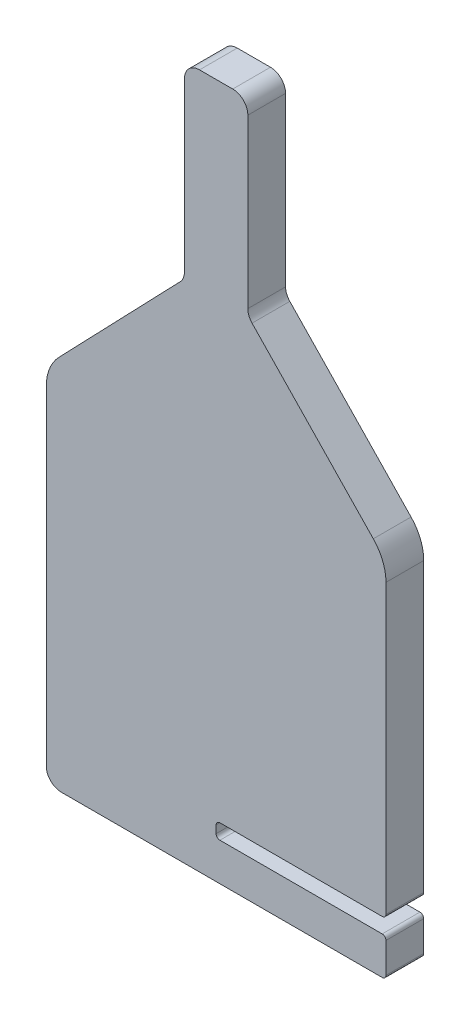
ISO-10303-21;
HEADER;
FILE_DESCRIPTION(('STEP AP214'),'2;1');
FILE_NAME('part.step','',(''),(''),'','','');
FILE_SCHEMA(('AUTOMOTIVE_DESIGN { 1 0 10303 214 1 1 1 1 }'));
ENDSEC;
DATA;
#1=APPLICATION_CONTEXT('core data for automotive mechanical design processes');
#2=APPLICATION_PROTOCOL_DEFINITION('international standard','automotive_design',2000,#1);
#3=PRODUCT_CONTEXT('',#1,'mechanical');
#4=PRODUCT('Part','Part','',(#3));
#5=PRODUCT_RELATED_PRODUCT_CATEGORY('part','',(#4));
#6=PRODUCT_DEFINITION_FORMATION('','',#4);
#7=PRODUCT_DEFINITION_CONTEXT('part definition',#1,'design');
#8=PRODUCT_DEFINITION('design','',#6,#7);
#9=PRODUCT_DEFINITION_SHAPE('','',#8);
#10=(LENGTH_UNIT() NAMED_UNIT(*) SI_UNIT(.MILLI.,.METRE.));
#11=(NAMED_UNIT(*) PLANE_ANGLE_UNIT() SI_UNIT($,.RADIAN.));
#12=(NAMED_UNIT(*) SI_UNIT($,.STERADIAN.) SOLID_ANGLE_UNIT());
#13=UNCERTAINTY_MEASURE_WITH_UNIT(LENGTH_MEASURE(1.E-05),#10,'distance_accuracy_value','');
#14=(GEOMETRIC_REPRESENTATION_CONTEXT(3) GLOBAL_UNCERTAINTY_ASSIGNED_CONTEXT((#13)) GLOBAL_UNIT_ASSIGNED_CONTEXT((#10,
#11,#12)) REPRESENTATION_CONTEXT('',''));
#15=CARTESIAN_POINT('',(0.,0.,0.));
#16=DIRECTION('',(0.,0.,1.));
#17=DIRECTION('',(1.,0.,0.));
#18=AXIS2_PLACEMENT_3D('',#15,#16,#17);
#19=CARTESIAN_POINT('',(22.5,0.971862939320625,5.));
#20=DIRECTION('',(1.,0.,0.));
#21=DIRECTION('',(0.,1.,0.));
#22=AXIS2_PLACEMENT_3D('',#19,#20,#21);
#23=PLANE('',#22);
#24=DIRECTION('',(0.,-1.,0.));
#25=VECTOR('',#24,1.);
#26=CARTESIAN_POINT('',(22.5,0.971862939320625,5.));
#27=LINE('',#26,#25);
#28=CARTESIAN_POINT('',(22.5,-1.4452330721166,5.));
#29=VERTEX_POINT('',#28);
#30=CARTESIAN_POINT('',(22.5,-39.5281370606794,5.));
#31=VERTEX_POINT('',#30);
#32=EDGE_CURVE('E403',#29,#31,#27,.T.);
#33=ORIENTED_EDGE('',*,*,#32,.T.);
#34=DIRECTION('',(0.,0.,1.));
#35=VECTOR('',#34,1.);
#36=CARTESIAN_POINT('',(22.5,-39.5281370606794,0.));
#37=LINE('',#36,#35);
#38=CARTESIAN_POINT('',(22.5,-39.5281370606794,0.));
#39=VERTEX_POINT('',#38);
#40=EDGE_CURVE('E382',#31,#39,#37,.F.);
#41=ORIENTED_EDGE('',*,*,#40,.T.);
#42=DIRECTION('',(0.,-1.,0.));
#43=VECTOR('',#42,1.);
#44=CARTESIAN_POINT('',(22.5,0.971862939320625,0.));
#45=LINE('',#44,#43);
#46=CARTESIAN_POINT('',(22.5,-1.4452330721166,0.));
#47=VERTEX_POINT('',#46);
#48=EDGE_CURVE('E234',#47,#39,#45,.T.);
#49=ORIENTED_EDGE('',*,*,#48,.F.);
#50=DIRECTION('',(0.,0.,-1.));
#51=VECTOR('',#50,1.);
#52=CARTESIAN_POINT('',(22.5,-1.4452330721166,5.));
#53=LINE('',#52,#51);
#54=EDGE_CURVE('E331',#47,#29,#53,.F.);
#55=ORIENTED_EDGE('',*,*,#54,.T.);
#56=EDGE_LOOP('',(#33,#41,#49,#55));
#57=FACE_BOUND('',#56,.T.);
#58=ADVANCED_FACE('F43',(#57),#23,.T.);
#59=CARTESIAN_POINT('',(-4.2,45.,5.));
#60=DIRECTION('',(0.,1.,0.));
#61=DIRECTION('',(0.,0.,1.));
#62=AXIS2_PLACEMENT_3D('',#59,#60,#61);
#63=PLANE('',#62);
#64=DIRECTION('',(1.,0.,0.));
#65=VECTOR('',#64,1.);
#66=CARTESIAN_POINT('',(-4.2,45.,0.));
#67=LINE('',#66,#65);
#68=CARTESIAN_POINT('',(-2.2,45.,0.));
#69=VERTEX_POINT('',#68);
#70=CARTESIAN_POINT('',(2.2,45.,0.));
#71=VERTEX_POINT('',#70);
#72=EDGE_CURVE('E427',#69,#71,#67,.T.);
#73=ORIENTED_EDGE('',*,*,#72,.F.);
#74=DIRECTION('',(0.,0.,-1.));
#75=VECTOR('',#74,1.);
#76=CARTESIAN_POINT('',(-2.2,45.,5.));
#77=LINE('',#76,#75);
#78=CARTESIAN_POINT('',(-2.2,45.,5.));
#79=VERTEX_POINT('',#78);
#80=EDGE_CURVE('E283',#69,#79,#77,.F.);
#81=ORIENTED_EDGE('',*,*,#80,.T.);
#82=DIRECTION('',(1.,0.,0.));
#83=VECTOR('',#82,1.);
#84=CARTESIAN_POINT('',(-4.2,45.,5.));
#85=LINE('',#84,#83);
#86=CARTESIAN_POINT('',(2.2,45.,5.));
#87=VERTEX_POINT('',#86);
#88=EDGE_CURVE('E251',#79,#87,#85,.T.);
#89=ORIENTED_EDGE('',*,*,#88,.T.);
#90=DIRECTION('',(0.,0.,-1.));
#91=VECTOR('',#90,1.);
#92=CARTESIAN_POINT('',(2.2,45.,5.));
#93=LINE('',#92,#91);
#94=EDGE_CURVE('E279',#87,#71,#93,.T.);
#95=ORIENTED_EDGE('',*,*,#94,.T.);
#96=EDGE_LOOP('',(#73,#81,#89,#95));
#97=FACE_BOUND('',#96,.T.);
#98=ADVANCED_FACE('F518',(#97),#63,.T.);
#99=CARTESIAN_POINT('',(-4.2,45.,5.));
#100=DIRECTION('',(1.,0.,0.));
#101=DIRECTION('',(0.,1.,0.));
#102=AXIS2_PLACEMENT_3D('',#99,#100,#101);
#103=PLANE('',#102);
#104=DIRECTION('',(0.,-1.,0.));
#105=VECTOR('',#104,1.);
#106=CARTESIAN_POINT('',(-4.2,45.,0.));
#107=LINE('',#106,#105);
#108=CARTESIAN_POINT('',(-4.2,43.,0.));
#109=VERTEX_POINT('',#108);
#110=CARTESIAN_POINT('',(-4.19999999999999,20.8056680808001,0.));
#111=VERTEX_POINT('',#110);
#112=EDGE_CURVE('E248',#109,#111,#107,.T.);
#113=ORIENTED_EDGE('',*,*,#112,.T.);
#114=DIRECTION('',(0.,0.,-1.));
#115=VECTOR('',#114,1.);
#116=CARTESIAN_POINT('',(-4.19999999999999,20.8056680808001,5.));
#117=LINE('',#116,#115);
#118=CARTESIAN_POINT('',(-4.19999999999999,20.8056680808001,5.));
#119=VERTEX_POINT('',#118);
#120=EDGE_CURVE('E276',#111,#119,#117,.F.);
#121=ORIENTED_EDGE('',*,*,#120,.T.);
#122=DIRECTION('',(0.,-1.,0.));
#123=VECTOR('',#122,1.);
#124=CARTESIAN_POINT('',(-4.2,45.,5.));
#125=LINE('',#124,#123);
#126=CARTESIAN_POINT('',(-4.2,43.,5.));
#127=VERTEX_POINT('',#126);
#128=EDGE_CURVE('E227',#127,#119,#125,.T.);
#129=ORIENTED_EDGE('',*,*,#128,.F.);
#130=DIRECTION('',(0.,0.,-1.));
#131=VECTOR('',#130,1.);
#132=CARTESIAN_POINT('',(-4.2,43.,0.));
#133=LINE('',#132,#131);
#134=EDGE_CURVE('E272',#127,#109,#133,.T.);
#135=ORIENTED_EDGE('',*,*,#134,.T.);
#136=EDGE_LOOP('',(#113,#121,#129,#135));
#137=FACE_BOUND('',#136,.T.);
#138=ADVANCED_FACE('F527',(#137),#103,.F.);
#139=CARTESIAN_POINT('',(-4.19999999999999,20.,5.));
#140=DIRECTION('',(0.720762767449976,-0.693181818181819,0.));
#141=DIRECTION('',(0.693181818181819,0.720762767449976,0.));
#142=AXIS2_PLACEMENT_3D('',#139,#140,#141);
#143=PLANE('',#142);
#144=DIRECTION('',(-0.693181818181819,-0.720762767449976,0.));
#145=VECTOR('',#144,1.);
#146=CARTESIAN_POINT('',(-4.19999999999999,20.,0.));
#147=LINE('',#146,#145);
#148=CARTESIAN_POINT('',(-4.75847446510004,19.4193044444364,0.));
#149=VERTEX_POINT('',#148);
#150=CARTESIAN_POINT('',(-20.8245766046999,2.71394960601132,0.));
#151=VERTEX_POINT('',#150);
#152=EDGE_CURVE('E238',#149,#151,#147,.T.);
#153=ORIENTED_EDGE('',*,*,#152,.T.);
#154=DIRECTION('',(0.,0.,-1.));
#155=VECTOR('',#154,1.);
#156=CARTESIAN_POINT('',(-20.8245766046999,2.71394960601132,5.));
#157=LINE('',#156,#155);
#158=CARTESIAN_POINT('',(-20.8245766046999,2.71394960601132,5.));
#159=VERTEX_POINT('',#158);
#160=EDGE_CURVE('E318',#151,#159,#157,.F.);
#161=ORIENTED_EDGE('',*,*,#160,.T.);
#162=DIRECTION('',(-0.693181818181819,-0.720762767449976,0.));
#163=VECTOR('',#162,1.);
#164=CARTESIAN_POINT('',(-4.19999999999999,20.,5.));
#165=LINE('',#164,#163);
#166=CARTESIAN_POINT('',(-4.75847446510004,19.4193044444364,5.));
#167=VERTEX_POINT('',#166);
#168=EDGE_CURVE('E394',#167,#159,#165,.T.);
#169=ORIENTED_EDGE('',*,*,#168,.F.);
#170=DIRECTION('',(0.,0.,-1.));
#171=VECTOR('',#170,1.);
#172=CARTESIAN_POINT('',(-4.75847446510004,19.4193044444364,0.));
#173=LINE('',#172,#171);
#174=EDGE_CURVE('E268',#167,#149,#173,.T.);
#175=ORIENTED_EDGE('',*,*,#174,.T.);
#176=EDGE_LOOP('',(#153,#161,#169,#175));
#177=FACE_BOUND('',#176,.T.);
#178=ADVANCED_FACE('F536',(#177),#143,.F.);
#179=CARTESIAN_POINT('',(-22.5,0.971862939320623,5.));
#180=DIRECTION('',(1.,0.,0.));
#181=DIRECTION('',(0.,1.,0.));
#182=AXIS2_PLACEMENT_3D('',#179,#180,#181);
#183=PLANE('',#182);
#184=DIRECTION('',(0.,-1.,0.));
#185=VECTOR('',#184,1.);
#186=CARTESIAN_POINT('',(-22.5,0.971862939320623,5.));
#187=LINE('',#186,#185);
#188=CARTESIAN_POINT('',(-22.5,-1.44514130307958,5.));
#189=VERTEX_POINT('',#188);
#190=CARTESIAN_POINT('',(-22.5,-45.0281370606794,5.));
#191=VERTEX_POINT('',#190);
#192=EDGE_CURVE('E398',#189,#191,#187,.T.);
#193=ORIENTED_EDGE('',*,*,#192,.F.);
#194=DIRECTION('',(0.,0.,-1.));
#195=VECTOR('',#194,1.);
#196=CARTESIAN_POINT('',(-22.5,-1.44514130307958,5.));
#197=LINE('',#196,#195);
#198=CARTESIAN_POINT('',(-22.5,-1.44514130307958,0.));
#199=VERTEX_POINT('',#198);
#200=EDGE_CURVE('E308',#189,#199,#197,.T.);
#201=ORIENTED_EDGE('',*,*,#200,.T.);
#202=DIRECTION('',(0.,-1.,0.));
#203=VECTOR('',#202,1.);
#204=CARTESIAN_POINT('',(-22.5,0.971862939320623,0.));
#205=LINE('',#204,#203);
#206=CARTESIAN_POINT('',(-22.5,-45.0281370606794,0.));
#207=VERTEX_POINT('',#206);
#208=EDGE_CURVE('E233',#199,#207,#205,.T.);
#209=ORIENTED_EDGE('',*,*,#208,.T.);
#210=DIRECTION('',(0.,0.,-1.));
#211=VECTOR('',#210,1.);
#212=CARTESIAN_POINT('',(-22.5,-45.0281370606794,5.));
#213=LINE('',#212,#211);
#214=EDGE_CURVE('E210',#207,#191,#213,.F.);
#215=ORIENTED_EDGE('',*,*,#214,.T.);
#216=EDGE_LOOP('',(#193,#201,#209,#215));
#217=FACE_BOUND('',#216,.T.);
#218=ADVANCED_FACE('F544',(#217),#183,.F.);
#219=CARTESIAN_POINT('',(-22.5,-47.0281370606794,5.));
#220=DIRECTION('',(0.,1.,0.));
#221=DIRECTION('',(0.,0.,1.));
#222=AXIS2_PLACEMENT_3D('',#219,#220,#221);
#223=PLANE('',#222);
#224=DIRECTION('',(1.,0.,0.));
#225=VECTOR('',#224,1.);
#226=CARTESIAN_POINT('',(-22.5,-47.0281370606794,0.));
#227=LINE('',#226,#225);
#228=CARTESIAN_POINT('',(-20.5,-47.0281370606794,0.));
#229=VERTEX_POINT('',#228);
#230=CARTESIAN_POINT('',(22.,-47.0281370606794,0.));
#231=VERTEX_POINT('',#230);
#232=EDGE_CURVE('E221',#229,#231,#227,.T.);
#233=ORIENTED_EDGE('',*,*,#232,.T.);
#234=DIRECTION('',(0.,0.,-1.));
#235=VECTOR('',#234,1.);
#236=CARTESIAN_POINT('',(22.,-47.0281370606794,5.));
#237=LINE('',#236,#235);
#238=CARTESIAN_POINT('',(22.,-47.0281370606794,5.));
#239=VERTEX_POINT('',#238);
#240=EDGE_CURVE('E350',#231,#239,#237,.F.);
#241=ORIENTED_EDGE('',*,*,#240,.T.);
#242=DIRECTION('',(1.,0.,0.));
#243=VECTOR('',#242,1.);
#244=CARTESIAN_POINT('',(-22.5,-47.0281370606794,5.));
#245=LINE('',#244,#243);
#246=CARTESIAN_POINT('',(-20.5,-47.0281370606794,5.));
#247=VERTEX_POINT('',#246);
#248=EDGE_CURVE('E224',#247,#239,#245,.T.);
#249=ORIENTED_EDGE('',*,*,#248,.F.);
#250=DIRECTION('',(0.,0.,-1.));
#251=VECTOR('',#250,1.);
#252=CARTESIAN_POINT('',(-20.5,-47.0281370606794,5.));
#253=LINE('',#252,#251);
#254=EDGE_CURVE('E208',#247,#229,#253,.T.);
#255=ORIENTED_EDGE('',*,*,#254,.T.);
#256=EDGE_LOOP('',(#233,#241,#249,#255));
#257=FACE_BOUND('',#256,.T.);
#258=ADVANCED_FACE('F220',(#257),#223,.F.);
#259=CARTESIAN_POINT('',(22.5,-42.5281370606794,5.));
#260=VERTEX_POINT('',#259);
#261=CARTESIAN_POINT('',(22.5,-46.5281370606794,5.));
#262=VERTEX_POINT('',#261);
#263=EDGE_CURVE('E406',#260,#262,#27,.T.);
#264=ORIENTED_EDGE('',*,*,#263,.T.);
#265=DIRECTION('',(0.,0.,-1.));
#266=VECTOR('',#265,1.);
#267=CARTESIAN_POINT('',(22.5,-46.5281370606794,0.));
#268=LINE('',#267,#266);
#269=CARTESIAN_POINT('',(22.5,-46.5281370606794,0.));
#270=VERTEX_POINT('',#269);
#271=EDGE_CURVE('E338',#262,#270,#268,.T.);
#272=ORIENTED_EDGE('',*,*,#271,.T.);
#273=CARTESIAN_POINT('',(22.5,-42.5281370606794,0.));
#274=VERTEX_POINT('',#273);
#275=EDGE_CURVE('E241',#274,#270,#45,.T.);
#276=ORIENTED_EDGE('',*,*,#275,.F.);
#277=DIRECTION('',(0.,0.,1.));
#278=VECTOR('',#277,1.);
#279=CARTESIAN_POINT('',(22.5,-42.5281370606794,5.));
#280=LINE('',#279,#278);
#281=EDGE_CURVE('E334',#274,#260,#280,.T.);
#282=ORIENTED_EDGE('',*,*,#281,.T.);
#283=EDGE_LOOP('',(#264,#272,#276,#282));
#284=FACE_BOUND('',#283,.T.);
#285=ADVANCED_FACE('F445',(#284),#23,.T.);
#286=CARTESIAN_POINT('',(4.20000000000001,19.9989976751405,5.));
#287=DIRECTION('',(0.720744523590116,0.693200787445352,0.));
#288=DIRECTION('',(-0.693200787445352,0.720744523590116,0.));
#289=AXIS2_PLACEMENT_3D('',#286,#287,#288);
#290=PLANE('',#289);
#291=DIRECTION('',(0.693200787445352,-0.720744523590116,0.));
#292=VECTOR('',#291,1.);
#293=CARTESIAN_POINT('',(4.20000000000001,19.9989976751405,5.));
#294=LINE('',#293,#292);
#295=CARTESIAN_POINT('',(4.75851095281978,19.4182947707288,5.));
#296=VERTEX_POINT('',#295);
#297=CARTESIAN_POINT('',(20.8244671415407,2.71397165255552,5.));
#298=VERTEX_POINT('',#297);
#299=EDGE_CURVE('E410',#296,#298,#294,.T.);
#300=ORIENTED_EDGE('',*,*,#299,.T.);
#301=DIRECTION('',(0.,0.,-1.));
#302=VECTOR('',#301,1.);
#303=CARTESIAN_POINT('',(20.8244671415407,2.71397165255551,5.));
#304=LINE('',#303,#302);
#305=CARTESIAN_POINT('',(20.8244671415407,2.71397165255552,0.));
#306=VERTEX_POINT('',#305);
#307=EDGE_CURVE('E327',#298,#306,#304,.T.);
#308=ORIENTED_EDGE('',*,*,#307,.T.);
#309=DIRECTION('',(0.693200787445352,-0.720744523590116,0.));
#310=VECTOR('',#309,1.);
#311=CARTESIAN_POINT('',(4.20000000000001,19.9989976751405,0.));
#312=LINE('',#311,#310);
#313=CARTESIAN_POINT('',(4.75851095281978,19.4182947707288,0.));
#314=VERTEX_POINT('',#313);
#315=EDGE_CURVE('E435',#314,#306,#312,.T.);
#316=ORIENTED_EDGE('',*,*,#315,.F.);
#317=DIRECTION('',(0.,0.,-1.));
#318=VECTOR('',#317,1.);
#319=CARTESIAN_POINT('',(4.75851095281978,19.4182947707288,5.));
#320=LINE('',#319,#318);
#321=EDGE_CURVE('E293',#314,#296,#320,.F.);
#322=ORIENTED_EDGE('',*,*,#321,.T.);
#323=EDGE_LOOP('',(#300,#308,#316,#322));
#324=FACE_BOUND('',#323,.T.);
#325=ADVANCED_FACE('F503',(#324),#290,.T.);
#326=CARTESIAN_POINT('',(4.2,45.,5.));
#327=DIRECTION('',(1.,0.,0.));
#328=DIRECTION('',(0.,1.,0.));
#329=AXIS2_PLACEMENT_3D('',#326,#327,#328);
#330=PLANE('',#329);
#331=DIRECTION('',(0.,-1.,0.));
#332=VECTOR('',#331,1.);
#333=CARTESIAN_POINT('',(4.2,45.,5.));
#334=LINE('',#333,#332);
#335=CARTESIAN_POINT('',(4.2,43.,5.));
#336=VERTEX_POINT('',#335);
#337=CARTESIAN_POINT('',(4.20000000000001,20.8046963456195,5.));
#338=VERTEX_POINT('',#337);
#339=EDGE_CURVE('E413',#336,#338,#334,.T.);
#340=ORIENTED_EDGE('',*,*,#339,.T.);
#341=DIRECTION('',(0.,0.,-1.));
#342=VECTOR('',#341,1.);
#343=CARTESIAN_POINT('',(4.20000000000001,20.8046963456195,0.));
#344=LINE('',#343,#342);
#345=CARTESIAN_POINT('',(4.20000000000001,20.8046963456195,0.));
#346=VERTEX_POINT('',#345);
#347=EDGE_CURVE('E289',#338,#346,#344,.T.);
#348=ORIENTED_EDGE('',*,*,#347,.T.);
#349=DIRECTION('',(0.,-1.,0.));
#350=VECTOR('',#349,1.);
#351=CARTESIAN_POINT('',(4.2,45.,0.));
#352=LINE('',#351,#350);
#353=CARTESIAN_POINT('',(4.2,43.,0.));
#354=VERTEX_POINT('',#353);
#355=EDGE_CURVE('E431',#354,#346,#352,.T.);
#356=ORIENTED_EDGE('',*,*,#355,.F.);
#357=DIRECTION('',(0.,0.,-1.));
#358=VECTOR('',#357,1.);
#359=CARTESIAN_POINT('',(4.2,43.,5.));
#360=LINE('',#359,#358);
#361=EDGE_CURVE('E286',#354,#336,#360,.F.);
#362=ORIENTED_EDGE('',*,*,#361,.T.);
#363=EDGE_LOOP('',(#340,#348,#356,#362));
#364=FACE_BOUND('',#363,.T.);
#365=ADVANCED_FACE('F512',(#364),#330,.T.);
#366=CARTESIAN_POINT('',(0.,0.,5.));
#367=DIRECTION('',(0.,0.,-1.));
#368=DIRECTION('',(-1.,0.,0.));
#369=AXIS2_PLACEMENT_3D('',#366,#367,#368);
#370=PLANE('',#369);
#371=ORIENTED_EDGE('',*,*,#248,.T.);
#372=CARTESIAN_POINT('',(22.,-46.5281370606794,5.));
#373=DIRECTION('',(0.,0.,-1.));
#374=DIRECTION('',(-1.,0.,0.));
#375=AXIS2_PLACEMENT_3D('',#372,#373,#374);
#376=CIRCLE('',#375,0.5);
#377=EDGE_CURVE('E358',#239,#262,#376,.F.);
#378=ORIENTED_EDGE('',*,*,#377,.T.);
#379=ORIENTED_EDGE('',*,*,#263,.F.);
#380=CARTESIAN_POINT('',(22.,-42.5281370606794,5.));
#381=DIRECTION('',(0.,0.,-1.));
#382=DIRECTION('',(-1.,0.,0.));
#383=AXIS2_PLACEMENT_3D('',#380,#381,#382);
#384=CIRCLE('',#383,0.5);
#385=CARTESIAN_POINT('',(22.,-42.0281370606794,5.));
#386=VERTEX_POINT('',#385);
#387=EDGE_CURVE('E353',#260,#386,#384,.F.);
#388=ORIENTED_EDGE('',*,*,#387,.T.);
#389=DIRECTION('',(1.,0.,0.));
#390=VECTOR('',#389,1.);
#391=CARTESIAN_POINT('',(22.5,-42.0281370606794,5.));
#392=LINE('',#391,#390);
#393=CARTESIAN_POINT('',(0.500000000000004,-42.0281370606794,5.));
#394=VERTEX_POINT('',#393);
#395=EDGE_CURVE('E453',#394,#386,#392,.T.);
#396=ORIENTED_EDGE('',*,*,#395,.F.);
#397=CARTESIAN_POINT('',(0.499999999999997,-41.5281370606794,5.));
#398=DIRECTION('',(0.,0.,-1.));
#399=DIRECTION('',(-1.,0.,0.));
#400=AXIS2_PLACEMENT_3D('',#397,#398,#399);
#401=CIRCLE('',#400,0.5);
#402=CARTESIAN_POINT('',(0.,-41.5281370606794,5.));
#403=VERTEX_POINT('',#402);
#404=EDGE_CURVE('E385',#394,#403,#401,.T.);
#405=ORIENTED_EDGE('',*,*,#404,.T.);
#406=DIRECTION('',(0.,-1.,0.));
#407=VECTOR('',#406,1.);
#408=CARTESIAN_POINT('',(0.,-40.0281370606794,5.));
#409=LINE('',#408,#407);
#410=CARTESIAN_POINT('',(0.,-40.5281370606794,5.));
#411=VERTEX_POINT('',#410);
#412=EDGE_CURVE('E460',#411,#403,#409,.T.);
#413=ORIENTED_EDGE('',*,*,#412,.F.);
#414=CARTESIAN_POINT('',(0.499999999999996,-40.5281370606794,5.));
#415=DIRECTION('',(0.,0.,-1.));
#416=DIRECTION('',(-1.,0.,0.));
#417=AXIS2_PLACEMENT_3D('',#414,#415,#416);
#418=CIRCLE('',#417,0.5);
#419=CARTESIAN_POINT('',(0.500000000000004,-40.0281370606794,5.));
#420=VERTEX_POINT('',#419);
#421=EDGE_CURVE('E52',#411,#420,#418,.T.);
#422=ORIENTED_EDGE('',*,*,#421,.T.);
#423=DIRECTION('',(-1.,0.,0.));
#424=VECTOR('',#423,1.);
#425=CARTESIAN_POINT('',(22.5,-40.0281370606794,5.));
#426=LINE('',#425,#424);
#427=CARTESIAN_POINT('',(22.,-40.0281370606794,5.));
#428=VERTEX_POINT('',#427);
#429=EDGE_CURVE('E467',#428,#420,#426,.T.);
#430=ORIENTED_EDGE('',*,*,#429,.F.);
#431=CARTESIAN_POINT('',(22.,-39.5281370606794,5.));
#432=DIRECTION('',(0.,0.,-1.));
#433=DIRECTION('',(-1.,0.,0.));
#434=AXIS2_PLACEMENT_3D('',#431,#432,#433);
#435=CIRCLE('',#434,0.5);
#436=EDGE_CURVE('E59',#428,#31,#435,.F.);
#437=ORIENTED_EDGE('',*,*,#436,.T.);
#438=ORIENTED_EDGE('',*,*,#32,.F.);
#439=CARTESIAN_POINT('',(16.5,-1.4452330721166,5.));
#440=DIRECTION('',(0.,0.,-1.));
#441=DIRECTION('',(-1.,0.,0.));
#442=AXIS2_PLACEMENT_3D('',#439,#440,#441);
#443=CIRCLE('',#442,6.);
#444=EDGE_CURVE('E321',#29,#298,#443,.F.);
#445=ORIENTED_EDGE('',*,*,#444,.T.);
#446=ORIENTED_EDGE('',*,*,#299,.F.);
#447=CARTESIAN_POINT('',(6.20000000000001,20.8046963456195,5.));
#448=DIRECTION('',(0.,0.,-1.));
#449=DIRECTION('',(-1.,0.,0.));
#450=AXIS2_PLACEMENT_3D('',#447,#448,#449);
#451=CIRCLE('',#450,2.);
#452=EDGE_CURVE('E305',#296,#338,#451,.T.);
#453=ORIENTED_EDGE('',*,*,#452,.T.);
#454=ORIENTED_EDGE('',*,*,#339,.F.);
#455=CARTESIAN_POINT('',(2.2,43.,5.));
#456=DIRECTION('',(0.,0.,-1.));
#457=DIRECTION('',(-1.,0.,0.));
#458=AXIS2_PLACEMENT_3D('',#455,#456,#457);
#459=CIRCLE('',#458,2.);
#460=EDGE_CURVE('E259',#336,#87,#459,.F.);
#461=ORIENTED_EDGE('',*,*,#460,.T.);
#462=ORIENTED_EDGE('',*,*,#88,.F.);
#463=CARTESIAN_POINT('',(-2.2,43.,5.));
#464=DIRECTION('',(0.,0.,-1.));
#465=DIRECTION('',(-1.,0.,0.));
#466=AXIS2_PLACEMENT_3D('',#463,#464,#465);
#467=CIRCLE('',#466,2.);
#468=EDGE_CURVE('E262',#79,#127,#467,.F.);
#469=ORIENTED_EDGE('',*,*,#468,.T.);
#470=ORIENTED_EDGE('',*,*,#128,.T.);
#471=CARTESIAN_POINT('',(-6.19999999999999,20.8056680808001,5.));
#472=DIRECTION('',(0.,0.,-1.));
#473=DIRECTION('',(-1.,0.,0.));
#474=AXIS2_PLACEMENT_3D('',#471,#472,#473);
#475=CIRCLE('',#474,2.);
#476=EDGE_CURVE('E299',#119,#167,#475,.T.);
#477=ORIENTED_EDGE('',*,*,#476,.T.);
#478=ORIENTED_EDGE('',*,*,#168,.T.);
#479=CARTESIAN_POINT('',(-16.5,-1.44514130307958,5.));
#480=DIRECTION('',(0.,0.,-1.));
#481=DIRECTION('',(-1.,0.,0.));
#482=AXIS2_PLACEMENT_3D('',#479,#480,#481);
#483=CIRCLE('',#482,6.);
#484=EDGE_CURVE('E324',#159,#189,#483,.F.);
#485=ORIENTED_EDGE('',*,*,#484,.T.);
#486=ORIENTED_EDGE('',*,*,#192,.T.);
#487=CARTESIAN_POINT('',(-20.5,-45.0281370606794,5.));
#488=DIRECTION('',(0.,0.,-1.));
#489=DIRECTION('',(-1.,0.,0.));
#490=AXIS2_PLACEMENT_3D('',#487,#488,#489);
#491=CIRCLE('',#490,2.);
#492=EDGE_CURVE('E265',#191,#247,#491,.F.);
#493=ORIENTED_EDGE('',*,*,#492,.T.);
#494=EDGE_LOOP('',(#371,#378,#379,#388,#396,#405,#413,#422,#430,#437,#438,#445,#446,#453,#454,
#461,#462,#469,#470,#477,#478,#485,#486,#493));
#495=FACE_BOUND('',#494,.T.);
#496=ADVANCED_FACE('F452',(#495),#370,.F.);
#497=CARTESIAN_POINT('',(0.,0.,0.));
#498=DIRECTION('',(0.,0.,-1.));
#499=DIRECTION('',(-1.,0.,0.));
#500=AXIS2_PLACEMENT_3D('',#497,#498,#499);
#501=PLANE('',#500);
#502=ORIENTED_EDGE('',*,*,#275,.T.);
#503=CARTESIAN_POINT('',(22.,-46.5281370606794,0.));
#504=DIRECTION('',(0.,0.,-1.));
#505=DIRECTION('',(-1.,0.,0.));
#506=AXIS2_PLACEMENT_3D('',#503,#504,#505);
#507=CIRCLE('',#506,0.5);
#508=EDGE_CURVE('E231',#270,#231,#507,.T.);
#509=ORIENTED_EDGE('',*,*,#508,.T.);
#510=ORIENTED_EDGE('',*,*,#232,.F.);
#511=CARTESIAN_POINT('',(-20.5,-45.0281370606794,0.));
#512=DIRECTION('',(0.,0.,-1.));
#513=DIRECTION('',(-1.,0.,0.));
#514=AXIS2_PLACEMENT_3D('',#511,#512,#513);
#515=CIRCLE('',#514,2.);
#516=EDGE_CURVE('E204',#229,#207,#515,.T.);
#517=ORIENTED_EDGE('',*,*,#516,.T.);
#518=ORIENTED_EDGE('',*,*,#208,.F.);
#519=CARTESIAN_POINT('',(-16.5,-1.44514130307958,0.));
#520=DIRECTION('',(0.,0.,-1.));
#521=DIRECTION('',(-1.,0.,0.));
#522=AXIS2_PLACEMENT_3D('',#519,#520,#521);
#523=CIRCLE('',#522,6.);
#524=EDGE_CURVE('E315',#199,#151,#523,.T.);
#525=ORIENTED_EDGE('',*,*,#524,.T.);
#526=ORIENTED_EDGE('',*,*,#152,.F.);
#527=CARTESIAN_POINT('',(-6.19999999999999,20.8056680808001,0.));
#528=DIRECTION('',(0.,0.,-1.));
#529=DIRECTION('',(-1.,0.,0.));
#530=AXIS2_PLACEMENT_3D('',#527,#528,#529);
#531=CIRCLE('',#530,2.);
#532=EDGE_CURVE('E296',#149,#111,#531,.F.);
#533=ORIENTED_EDGE('',*,*,#532,.T.);
#534=ORIENTED_EDGE('',*,*,#112,.F.);
#535=CARTESIAN_POINT('',(-2.2,43.,0.));
#536=DIRECTION('',(0.,0.,-1.));
#537=DIRECTION('',(-1.,0.,0.));
#538=AXIS2_PLACEMENT_3D('',#535,#536,#537);
#539=CIRCLE('',#538,2.);
#540=EDGE_CURVE('E215',#109,#69,#539,.T.);
#541=ORIENTED_EDGE('',*,*,#540,.T.);
#542=ORIENTED_EDGE('',*,*,#72,.T.);
#543=CARTESIAN_POINT('',(2.2,43.,0.));
#544=DIRECTION('',(0.,0.,-1.));
#545=DIRECTION('',(-1.,0.,0.));
#546=AXIS2_PLACEMENT_3D('',#543,#544,#545);
#547=CIRCLE('',#546,2.);
#548=EDGE_CURVE('E226',#71,#354,#547,.T.);
#549=ORIENTED_EDGE('',*,*,#548,.T.);
#550=ORIENTED_EDGE('',*,*,#355,.T.);
#551=CARTESIAN_POINT('',(6.20000000000001,20.8046963456195,0.));
#552=DIRECTION('',(0.,0.,-1.));
#553=DIRECTION('',(-1.,0.,0.));
#554=AXIS2_PLACEMENT_3D('',#551,#552,#553);
#555=CIRCLE('',#554,2.);
#556=EDGE_CURVE('E302',#346,#314,#555,.F.);
#557=ORIENTED_EDGE('',*,*,#556,.T.);
#558=ORIENTED_EDGE('',*,*,#315,.T.);
#559=CARTESIAN_POINT('',(16.5,-1.4452330721166,0.));
#560=DIRECTION('',(0.,0.,-1.));
#561=DIRECTION('',(-1.,0.,0.));
#562=AXIS2_PLACEMENT_3D('',#559,#560,#561);
#563=CIRCLE('',#562,6.);
#564=EDGE_CURVE('E312',#306,#47,#563,.T.);
#565=ORIENTED_EDGE('',*,*,#564,.T.);
#566=ORIENTED_EDGE('',*,*,#48,.T.);
#567=CARTESIAN_POINT('',(22.,-39.5281370606794,0.));
#568=DIRECTION('',(0.,0.,-1.));
#569=DIRECTION('',(-1.,0.,0.));
#570=AXIS2_PLACEMENT_3D('',#567,#568,#569);
#571=CIRCLE('',#570,0.5);
#572=CARTESIAN_POINT('',(22.,-40.0281370606794,0.));
#573=VERTEX_POINT('',#572);
#574=EDGE_CURVE('E345',#39,#573,#571,.T.);
#575=ORIENTED_EDGE('',*,*,#574,.T.);
#576=DIRECTION('',(-1.,0.,0.));
#577=VECTOR('',#576,1.);
#578=CARTESIAN_POINT('',(22.5,-40.0281370606794,0.));
#579=LINE('',#578,#577);
#580=CARTESIAN_POINT('',(0.499999999999997,-40.0281370606794,0.));
#581=VERTEX_POINT('',#580);
#582=EDGE_CURVE('E459',#573,#581,#579,.T.);
#583=ORIENTED_EDGE('',*,*,#582,.T.);
#584=CARTESIAN_POINT('',(0.499999999999996,-40.5281370606794,0.));
#585=DIRECTION('',(0.,0.,-1.));
#586=DIRECTION('',(-1.,0.,0.));
#587=AXIS2_PLACEMENT_3D('',#584,#585,#586);
#588=CIRCLE('',#587,0.5);
#589=CARTESIAN_POINT('',(0.,-40.5281370606794,0.));
#590=VERTEX_POINT('',#589);
#591=EDGE_CURVE('E11',#581,#590,#588,.F.);
#592=ORIENTED_EDGE('',*,*,#591,.T.);
#593=DIRECTION('',(0.,-1.,0.));
#594=VECTOR('',#593,1.);
#595=CARTESIAN_POINT('',(0.,-40.0281370606794,0.));
#596=LINE('',#595,#594);
#597=CARTESIAN_POINT('',(0.,-41.5281370606794,0.));
#598=VERTEX_POINT('',#597);
#599=EDGE_CURVE('E424',#590,#598,#596,.T.);
#600=ORIENTED_EDGE('',*,*,#599,.T.);
#601=CARTESIAN_POINT('',(0.499999999999997,-41.5281370606794,0.));
#602=DIRECTION('',(0.,0.,-1.));
#603=DIRECTION('',(-1.,0.,0.));
#604=AXIS2_PLACEMENT_3D('',#601,#602,#603);
#605=CIRCLE('',#604,0.5);
#606=CARTESIAN_POINT('',(0.499999999999997,-42.0281370606794,0.));
#607=VERTEX_POINT('',#606);
#608=EDGE_CURVE('E388',#598,#607,#605,.F.);
#609=ORIENTED_EDGE('',*,*,#608,.T.);
#610=DIRECTION('',(1.,0.,0.));
#611=VECTOR('',#610,1.);
#612=CARTESIAN_POINT('',(22.5,-42.0281370606794,0.));
#613=LINE('',#612,#611);
#614=CARTESIAN_POINT('',(22.,-42.0281370606794,0.));
#615=VERTEX_POINT('',#614);
#616=EDGE_CURVE('E432',#607,#615,#613,.T.);
#617=ORIENTED_EDGE('',*,*,#616,.T.);
#618=CARTESIAN_POINT('',(22.,-42.5281370606794,0.));
#619=DIRECTION('',(0.,0.,-1.));
#620=DIRECTION('',(-1.,0.,0.));
#621=AXIS2_PLACEMENT_3D('',#618,#619,#620);
#622=CIRCLE('',#621,0.5);
#623=EDGE_CURVE('E342',#615,#274,#622,.T.);
#624=ORIENTED_EDGE('',*,*,#623,.T.);
#625=EDGE_LOOP('',(#502,#509,#510,#517,#518,#525,#526,#533,#534,#541,#542,#549,#550,#557,#558,
#565,#566,#575,#583,#592,#600,#609,#617,#624));
#626=FACE_BOUND('',#625,.T.);
#627=ADVANCED_FACE('F230',(#626),#501,.T.);
#628=CARTESIAN_POINT('',(22.5,-40.0281370606794,-22.588713996153));
#629=DIRECTION('',(0.,1.,0.));
#630=DIRECTION('',(-1.,0.,0.));
#631=AXIS2_PLACEMENT_3D('',#628,#629,#630);
#632=PLANE('',#631);
#633=ORIENTED_EDGE('',*,*,#429,.T.);
#634=DIRECTION('',(0.,0.,1.));
#635=VECTOR('',#634,1.);
#636=CARTESIAN_POINT('',(0.499999999999996,-40.0281370606794,0.));
#637=LINE('',#636,#635);
#638=EDGE_CURVE('E379',#420,#581,#637,.F.);
#639=ORIENTED_EDGE('',*,*,#638,.T.);
#640=ORIENTED_EDGE('',*,*,#582,.F.);
#641=DIRECTION('',(0.,0.,1.));
#642=VECTOR('',#641,1.);
#643=CARTESIAN_POINT('',(22.,-40.0281370606794,5.));
#644=LINE('',#643,#642);
#645=EDGE_CURVE('E375',#573,#428,#644,.T.);
#646=ORIENTED_EDGE('',*,*,#645,.T.);
#647=EDGE_LOOP('',(#633,#639,#640,#646));
#648=FACE_BOUND('',#647,.T.);
#649=ADVANCED_FACE('F488',(#648),#632,.F.);
#650=CARTESIAN_POINT('',(0.,-40.0281370606794,-22.588713996153));
#651=DIRECTION('',(-1.,0.,0.));
#652=DIRECTION('',(0.,-1.,0.));
#653=AXIS2_PLACEMENT_3D('',#650,#651,#652);
#654=PLANE('',#653);
#655=ORIENTED_EDGE('',*,*,#412,.T.);
#656=DIRECTION('',(0.,0.,1.));
#657=VECTOR('',#656,1.);
#658=CARTESIAN_POINT('',(0.,-41.5281370606794,0.));
#659=LINE('',#658,#657);
#660=EDGE_CURVE('E372',#403,#598,#659,.F.);
#661=ORIENTED_EDGE('',*,*,#660,.T.);
#662=ORIENTED_EDGE('',*,*,#599,.F.);
#663=DIRECTION('',(0.,0.,1.));
#664=VECTOR('',#663,1.);
#665=CARTESIAN_POINT('',(0.,-40.5281370606794,5.));
#666=LINE('',#665,#664);
#667=EDGE_CURVE('E368',#590,#411,#666,.T.);
#668=ORIENTED_EDGE('',*,*,#667,.T.);
#669=EDGE_LOOP('',(#655,#661,#662,#668));
#670=FACE_BOUND('',#669,.T.);
#671=ADVANCED_FACE('F482',(#670),#654,.F.);
#672=CARTESIAN_POINT('',(22.5,-42.0281370606794,-22.588713996153));
#673=DIRECTION('',(0.,-1.,0.));
#674=DIRECTION('',(1.,0.,0.));
#675=AXIS2_PLACEMENT_3D('',#672,#673,#674);
#676=PLANE('',#675);
#677=ORIENTED_EDGE('',*,*,#616,.F.);
#678=DIRECTION('',(0.,0.,1.));
#679=VECTOR('',#678,1.);
#680=CARTESIAN_POINT('',(0.499999999999997,-42.0281370606794,5.));
#681=LINE('',#680,#679);
#682=EDGE_CURVE('E364',#607,#394,#681,.T.);
#683=ORIENTED_EDGE('',*,*,#682,.T.);
#684=ORIENTED_EDGE('',*,*,#395,.T.);
#685=DIRECTION('',(0.,0.,1.));
#686=VECTOR('',#685,1.);
#687=CARTESIAN_POINT('',(22.,-42.0281370606794,0.));
#688=LINE('',#687,#686);
#689=EDGE_CURVE('E361',#386,#615,#688,.F.);
#690=ORIENTED_EDGE('',*,*,#689,.T.);
#691=EDGE_LOOP('',(#677,#683,#684,#690));
#692=FACE_BOUND('',#691,.T.);
#693=ADVANCED_FACE('F456',(#692),#676,.F.);
#694=CARTESIAN_POINT('',(-20.5,-45.0281370606794,5.));
#695=DIRECTION('',(0.,0.,-1.));
#696=DIRECTION('',(-1.,0.,0.));
#697=AXIS2_PLACEMENT_3D('',#694,#695,#696);
#698=CYLINDRICAL_SURFACE('',#697,2.);
#699=ORIENTED_EDGE('',*,*,#492,.F.);
#700=ORIENTED_EDGE('',*,*,#214,.F.);
#701=ORIENTED_EDGE('',*,*,#516,.F.);
#702=ORIENTED_EDGE('',*,*,#254,.F.);
#703=EDGE_LOOP('',(#699,#700,#701,#702));
#704=FACE_BOUND('',#703,.T.);
#705=ADVANCED_FACE('F207',(#704),#698,.T.);
#706=CARTESIAN_POINT('',(-6.19999999999999,20.8056680808001,5.));
#707=DIRECTION('',(0.,0.,1.));
#708=DIRECTION('',(1.,0.,0.));
#709=AXIS2_PLACEMENT_3D('',#706,#707,#708);
#710=CYLINDRICAL_SURFACE('',#709,2.);
#711=ORIENTED_EDGE('',*,*,#476,.F.);
#712=ORIENTED_EDGE('',*,*,#120,.F.);
#713=ORIENTED_EDGE('',*,*,#532,.F.);
#714=ORIENTED_EDGE('',*,*,#174,.F.);
#715=EDGE_LOOP('',(#711,#712,#713,#714));
#716=FACE_BOUND('',#715,.T.);
#717=ADVANCED_FACE('F531',(#716),#710,.F.);
#718=CARTESIAN_POINT('',(-2.2,43.,5.));
#719=DIRECTION('',(0.,0.,1.));
#720=DIRECTION('',(1.,0.,0.));
#721=AXIS2_PLACEMENT_3D('',#718,#719,#720);
#722=CYLINDRICAL_SURFACE('',#721,2.);
#723=ORIENTED_EDGE('',*,*,#468,.F.);
#724=ORIENTED_EDGE('',*,*,#80,.F.);
#725=ORIENTED_EDGE('',*,*,#540,.F.);
#726=ORIENTED_EDGE('',*,*,#134,.F.);
#727=EDGE_LOOP('',(#723,#724,#725,#726));
#728=FACE_BOUND('',#727,.T.);
#729=ADVANCED_FACE('F522',(#728),#722,.T.);
#730=CARTESIAN_POINT('',(6.20000000000001,20.8046963456195,5.));
#731=DIRECTION('',(0.,0.,1.));
#732=DIRECTION('',(1.,0.,0.));
#733=AXIS2_PLACEMENT_3D('',#730,#731,#732);
#734=CYLINDRICAL_SURFACE('',#733,2.);
#735=ORIENTED_EDGE('',*,*,#452,.F.);
#736=ORIENTED_EDGE('',*,*,#321,.F.);
#737=ORIENTED_EDGE('',*,*,#556,.F.);
#738=ORIENTED_EDGE('',*,*,#347,.F.);
#739=EDGE_LOOP('',(#735,#736,#737,#738));
#740=FACE_BOUND('',#739,.T.);
#741=ADVANCED_FACE('F509',(#740),#734,.F.);
#742=CARTESIAN_POINT('',(2.2,43.,5.));
#743=DIRECTION('',(0.,0.,-1.));
#744=DIRECTION('',(-1.,0.,0.));
#745=AXIS2_PLACEMENT_3D('',#742,#743,#744);
#746=CYLINDRICAL_SURFACE('',#745,2.);
#747=ORIENTED_EDGE('',*,*,#460,.F.);
#748=ORIENTED_EDGE('',*,*,#361,.F.);
#749=ORIENTED_EDGE('',*,*,#548,.F.);
#750=ORIENTED_EDGE('',*,*,#94,.F.);
#751=EDGE_LOOP('',(#747,#748,#749,#750));
#752=FACE_BOUND('',#751,.T.);
#753=ADVANCED_FACE('F517',(#752),#746,.T.);
#754=CARTESIAN_POINT('',(-16.5,-1.44514130307958,5.));
#755=DIRECTION('',(0.,0.,-1.));
#756=DIRECTION('',(-1.,0.,0.));
#757=AXIS2_PLACEMENT_3D('',#754,#755,#756);
#758=CYLINDRICAL_SURFACE('',#757,6.);
#759=ORIENTED_EDGE('',*,*,#484,.F.);
#760=ORIENTED_EDGE('',*,*,#160,.F.);
#761=ORIENTED_EDGE('',*,*,#524,.F.);
#762=ORIENTED_EDGE('',*,*,#200,.F.);
#763=EDGE_LOOP('',(#759,#760,#761,#762));
#764=FACE_BOUND('',#763,.T.);
#765=ADVANCED_FACE('F540',(#764),#758,.T.);
#766=CARTESIAN_POINT('',(16.5,-1.4452330721166,5.));
#767=DIRECTION('',(0.,0.,-1.));
#768=DIRECTION('',(-1.,0.,0.));
#769=AXIS2_PLACEMENT_3D('',#766,#767,#768);
#770=CYLINDRICAL_SURFACE('',#769,6.);
#771=ORIENTED_EDGE('',*,*,#444,.F.);
#772=ORIENTED_EDGE('',*,*,#54,.F.);
#773=ORIENTED_EDGE('',*,*,#564,.F.);
#774=ORIENTED_EDGE('',*,*,#307,.F.);
#775=EDGE_LOOP('',(#771,#772,#773,#774));
#776=FACE_BOUND('',#775,.T.);
#777=ADVANCED_FACE('F501',(#776),#770,.T.);
#778=CARTESIAN_POINT('',(22.,-46.5281370606794,5.));
#779=DIRECTION('',(0.,0.,1.));
#780=DIRECTION('',(1.,0.,0.));
#781=AXIS2_PLACEMENT_3D('',#778,#779,#780);
#782=CYLINDRICAL_SURFACE('',#781,0.5);
#783=ORIENTED_EDGE('',*,*,#377,.F.);
#784=ORIENTED_EDGE('',*,*,#240,.F.);
#785=ORIENTED_EDGE('',*,*,#508,.F.);
#786=ORIENTED_EDGE('',*,*,#271,.F.);
#787=EDGE_LOOP('',(#783,#784,#785,#786));
#788=FACE_BOUND('',#787,.T.);
#789=ADVANCED_FACE('F547',(#788),#782,.T.);
#790=CARTESIAN_POINT('',(0.499999999999997,-41.5281370606794,-22.588713996153));
#791=DIRECTION('',(0.,0.,-1.));
#792=DIRECTION('',(-1.,0.,0.));
#793=AXIS2_PLACEMENT_3D('',#790,#791,#792);
#794=CYLINDRICAL_SURFACE('',#793,0.5);
#795=ORIENTED_EDGE('',*,*,#608,.F.);
#796=ORIENTED_EDGE('',*,*,#660,.F.);
#797=ORIENTED_EDGE('',*,*,#404,.F.);
#798=ORIENTED_EDGE('',*,*,#682,.F.);
#799=EDGE_LOOP('',(#795,#796,#797,#798));
#800=FACE_BOUND('',#799,.T.);
#801=ADVANCED_FACE('F481',(#800),#794,.F.);
#802=CARTESIAN_POINT('',(0.499999999999996,-40.5281370606794,-22.588713996153));
#803=DIRECTION('',(0.,0.,-1.));
#804=DIRECTION('',(-1.,0.,0.));
#805=AXIS2_PLACEMENT_3D('',#802,#803,#804);
#806=CYLINDRICAL_SURFACE('',#805,0.5);
#807=ORIENTED_EDGE('',*,*,#591,.F.);
#808=ORIENTED_EDGE('',*,*,#638,.F.);
#809=ORIENTED_EDGE('',*,*,#421,.F.);
#810=ORIENTED_EDGE('',*,*,#667,.F.);
#811=EDGE_LOOP('',(#807,#808,#809,#810));
#812=FACE_BOUND('',#811,.T.);
#813=ADVANCED_FACE('F484',(#812),#806,.F.);
#814=CARTESIAN_POINT('',(22.,-39.5281370606794,-22.588713996153));
#815=DIRECTION('',(0.,0.,-1.));
#816=DIRECTION('',(-1.,0.,0.));
#817=AXIS2_PLACEMENT_3D('',#814,#815,#816);
#818=CYLINDRICAL_SURFACE('',#817,0.5);
#819=ORIENTED_EDGE('',*,*,#574,.F.);
#820=ORIENTED_EDGE('',*,*,#40,.F.);
#821=ORIENTED_EDGE('',*,*,#436,.F.);
#822=ORIENTED_EDGE('',*,*,#645,.F.);
#823=EDGE_LOOP('',(#819,#820,#821,#822));
#824=FACE_BOUND('',#823,.T.);
#825=ADVANCED_FACE('F494',(#824),#818,.T.);
#826=CARTESIAN_POINT('',(22.,-42.5281370606794,5.));
#827=DIRECTION('',(0.,0.,-1.));
#828=DIRECTION('',(-1.,0.,0.));
#829=AXIS2_PLACEMENT_3D('',#826,#827,#828);
#830=CYLINDRICAL_SURFACE('',#829,0.5);
#831=ORIENTED_EDGE('',*,*,#623,.F.);
#832=ORIENTED_EDGE('',*,*,#689,.F.);
#833=ORIENTED_EDGE('',*,*,#387,.F.);
#834=ORIENTED_EDGE('',*,*,#281,.F.);
#835=EDGE_LOOP('',(#831,#832,#833,#834));
#836=FACE_BOUND('',#835,.T.);
#837=ADVANCED_FACE('F45',(#836),#830,.T.);
#838=CLOSED_SHELL('',(#58,#98,#138,#178,#218,#258,#285,#325,#365,#496,#627,#649,#671,#693,#705,
#717,#729,#741,#753,#765,#777,#789,#801,#813,#825,#837));
#839=MANIFOLD_SOLID_BREP('B2',#838);
#840=ADVANCED_BREP_SHAPE_REPRESENTATION('',(#18,#839),#14);
#841=SHAPE_DEFINITION_REPRESENTATION(#9,#840);
ENDSEC;
END-ISO-10303-21;
